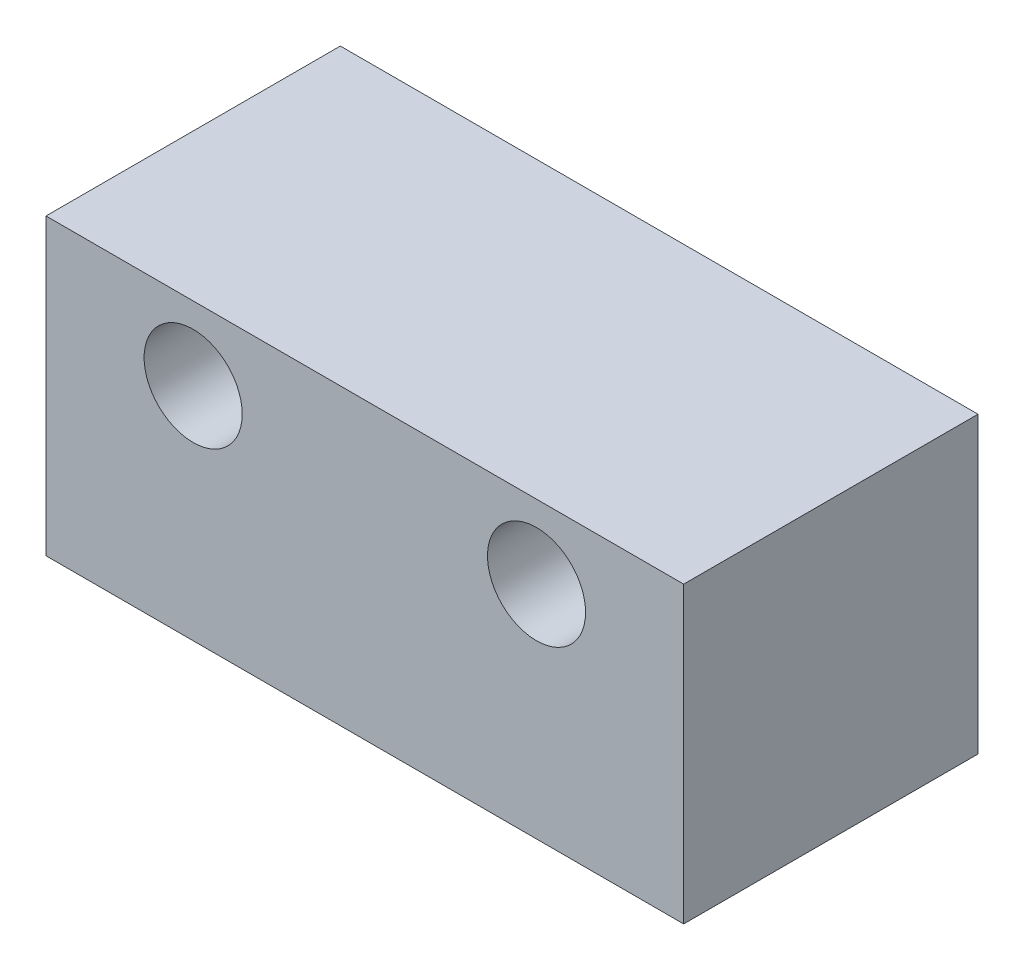
ISO-10303-21;
HEADER;
FILE_DESCRIPTION(('STEP AP214'),'2;1');
FILE_NAME('part.step','',(''),(''),'','','');
FILE_SCHEMA(('AUTOMOTIVE_DESIGN { 1 0 10303 214 1 1 1 1 }'));
ENDSEC;
DATA;
#1=APPLICATION_CONTEXT('core data for automotive mechanical design processes');
#2=APPLICATION_PROTOCOL_DEFINITION('international standard','automotive_design',2000,#1);
#3=PRODUCT_CONTEXT('',#1,'mechanical');
#4=PRODUCT('Part','Part','',(#3));
#5=PRODUCT_RELATED_PRODUCT_CATEGORY('part','',(#4));
#6=PRODUCT_DEFINITION_FORMATION('','',#4);
#7=PRODUCT_DEFINITION_CONTEXT('part definition',#1,'design');
#8=PRODUCT_DEFINITION('design','',#6,#7);
#9=PRODUCT_DEFINITION_SHAPE('','',#8);
#10=(LENGTH_UNIT() NAMED_UNIT(*) SI_UNIT(.MILLI.,.METRE.));
#11=(NAMED_UNIT(*) PLANE_ANGLE_UNIT() SI_UNIT($,.RADIAN.));
#12=(NAMED_UNIT(*) SI_UNIT($,.STERADIAN.) SOLID_ANGLE_UNIT());
#13=UNCERTAINTY_MEASURE_WITH_UNIT(LENGTH_MEASURE(1.E-05),#10,'distance_accuracy_value','');
#14=(GEOMETRIC_REPRESENTATION_CONTEXT(3) GLOBAL_UNCERTAINTY_ASSIGNED_CONTEXT((#13)) GLOBAL_UNIT_ASSIGNED_CONTEXT((#10,
#11,#12)) REPRESENTATION_CONTEXT('',''));
#15=CARTESIAN_POINT('',(0.,0.,0.));
#16=DIRECTION('',(0.,0.,1.));
#17=DIRECTION('',(1.,0.,0.));
#18=AXIS2_PLACEMENT_3D('',#15,#16,#17);
#19=CARTESIAN_POINT('',(0.,0.,6.));
#20=DIRECTION('',(-1.,0.,0.));
#21=DIRECTION('',(0.,0.,1.));
#22=AXIS2_PLACEMENT_3D('',#19,#20,#21);
#23=PLANE('',#22);
#24=DIRECTION('',(0.,1.,0.));
#25=VECTOR('',#24,1.);
#26=CARTESIAN_POINT('',(0.,0.,0.));
#27=LINE('',#26,#25);
#28=CARTESIAN_POINT('',(0.,0.,0.));
#29=VERTEX_POINT('',#28);
#30=CARTESIAN_POINT('',(0.,6.,0.));
#31=VERTEX_POINT('',#30);
#32=EDGE_CURVE('E111',#29,#31,#27,.T.);
#33=ORIENTED_EDGE('',*,*,#32,.F.);
#34=DIRECTION('',(0.,0.,-1.));
#35=VECTOR('',#34,1.);
#36=CARTESIAN_POINT('',(0.,0.,6.));
#37=LINE('',#36,#35);
#38=CARTESIAN_POINT('',(0.,0.,6.));
#39=VERTEX_POINT('',#38);
#40=EDGE_CURVE('E11',#39,#29,#37,.T.);
#41=ORIENTED_EDGE('',*,*,#40,.F.);
#42=DIRECTION('',(0.,1.,0.));
#43=VECTOR('',#42,1.);
#44=CARTESIAN_POINT('',(0.,0.,6.));
#45=LINE('',#44,#43);
#46=CARTESIAN_POINT('',(0.,6.,6.));
#47=VERTEX_POINT('',#46);
#48=EDGE_CURVE('E103',#39,#47,#45,.T.);
#49=ORIENTED_EDGE('',*,*,#48,.T.);
#50=DIRECTION('',(0.,0.,-1.));
#51=VECTOR('',#50,1.);
#52=CARTESIAN_POINT('',(0.,6.,6.));
#53=LINE('',#52,#51);
#54=EDGE_CURVE('E42',#47,#31,#53,.T.);
#55=ORIENTED_EDGE('',*,*,#54,.T.);
#56=EDGE_LOOP('',(#33,#41,#49,#55));
#57=FACE_BOUND('',#56,.T.);
#58=ADVANCED_FACE('F39',(#57),#23,.T.);
#59=CARTESIAN_POINT('',(0.,0.,6.));
#60=DIRECTION('',(0.,1.,0.));
#61=DIRECTION('',(0.,0.,1.));
#62=AXIS2_PLACEMENT_3D('',#59,#60,#61);
#63=PLANE('',#62);
#64=DIRECTION('',(1.,0.,0.));
#65=VECTOR('',#64,1.);
#66=CARTESIAN_POINT('',(0.,0.,0.));
#67=LINE('',#66,#65);
#68=CARTESIAN_POINT('',(13.,0.,0.));
#69=VERTEX_POINT('',#68);
#70=EDGE_CURVE('E73',#29,#69,#67,.T.);
#71=ORIENTED_EDGE('',*,*,#70,.T.);
#72=DIRECTION('',(0.,0.,-1.));
#73=VECTOR('',#72,1.);
#74=CARTESIAN_POINT('',(13.,0.,6.));
#75=LINE('',#74,#73);
#76=CARTESIAN_POINT('',(13.,0.,6.));
#77=VERTEX_POINT('',#76);
#78=EDGE_CURVE('E49',#77,#69,#75,.T.);
#79=ORIENTED_EDGE('',*,*,#78,.F.);
#80=DIRECTION('',(1.,0.,0.));
#81=VECTOR('',#80,1.);
#82=CARTESIAN_POINT('',(0.,0.,6.));
#83=LINE('',#82,#81);
#84=EDGE_CURVE('E90',#39,#77,#83,.T.);
#85=ORIENTED_EDGE('',*,*,#84,.F.);
#86=ORIENTED_EDGE('',*,*,#40,.T.);
#87=EDGE_LOOP('',(#71,#79,#85,#86));
#88=FACE_BOUND('',#87,.T.);
#89=ADVANCED_FACE('F128',(#88),#63,.F.);
#90=CARTESIAN_POINT('',(13.,0.,6.));
#91=DIRECTION('',(-1.,0.,0.));
#92=DIRECTION('',(0.,0.,1.));
#93=AXIS2_PLACEMENT_3D('',#90,#91,#92);
#94=PLANE('',#93);
#95=DIRECTION('',(0.,1.,0.));
#96=VECTOR('',#95,1.);
#97=CARTESIAN_POINT('',(13.,0.,0.));
#98=LINE('',#97,#96);
#99=CARTESIAN_POINT('',(13.,6.,0.));
#100=VERTEX_POINT('',#99);
#101=EDGE_CURVE('E98',#69,#100,#98,.T.);
#102=ORIENTED_EDGE('',*,*,#101,.T.);
#103=DIRECTION('',(0.,0.,-1.));
#104=VECTOR('',#103,1.);
#105=CARTESIAN_POINT('',(13.,6.,6.));
#106=LINE('',#105,#104);
#107=CARTESIAN_POINT('',(13.,6.,6.));
#108=VERTEX_POINT('',#107);
#109=EDGE_CURVE('E95',#108,#100,#106,.T.);
#110=ORIENTED_EDGE('',*,*,#109,.F.);
#111=DIRECTION('',(0.,1.,0.));
#112=VECTOR('',#111,1.);
#113=CARTESIAN_POINT('',(13.,0.,6.));
#114=LINE('',#113,#112);
#115=EDGE_CURVE('E85',#77,#108,#114,.T.);
#116=ORIENTED_EDGE('',*,*,#115,.F.);
#117=ORIENTED_EDGE('',*,*,#78,.T.);
#118=EDGE_LOOP('',(#102,#110,#116,#117));
#119=FACE_BOUND('',#118,.T.);
#120=ADVANCED_FACE('F96',(#119),#94,.F.);
#121=CARTESIAN_POINT('',(0.,6.,6.));
#122=DIRECTION('',(0.,1.,0.));
#123=DIRECTION('',(0.,0.,1.));
#124=AXIS2_PLACEMENT_3D('',#121,#122,#123);
#125=PLANE('',#124);
#126=DIRECTION('',(1.,0.,0.));
#127=VECTOR('',#126,1.);
#128=CARTESIAN_POINT('',(0.,6.,0.));
#129=LINE('',#128,#127);
#130=EDGE_CURVE('E115',#31,#100,#129,.T.);
#131=ORIENTED_EDGE('',*,*,#130,.F.);
#132=ORIENTED_EDGE('',*,*,#54,.F.);
#133=DIRECTION('',(1.,0.,0.));
#134=VECTOR('',#133,1.);
#135=CARTESIAN_POINT('',(0.,6.,6.));
#136=LINE('',#135,#134);
#137=EDGE_CURVE('E89',#47,#108,#136,.T.);
#138=ORIENTED_EDGE('',*,*,#137,.T.);
#139=ORIENTED_EDGE('',*,*,#109,.T.);
#140=EDGE_LOOP('',(#131,#132,#138,#139));
#141=FACE_BOUND('',#140,.T.);
#142=ADVANCED_FACE('F101',(#141),#125,.T.);
#143=CARTESIAN_POINT('',(0.,0.,6.));
#144=DIRECTION('',(0.,0.,-1.));
#145=DIRECTION('',(-1.,0.,0.));
#146=AXIS2_PLACEMENT_3D('',#143,#144,#145);
#147=PLANE('',#146);
#148=CARTESIAN_POINT('',(3.,4.5,6.));
#149=DIRECTION('',(0.,0.,1.));
#150=DIRECTION('',(1.,0.,0.));
#151=AXIS2_PLACEMENT_3D('',#148,#149,#150);
#152=CIRCLE('',#151,1.);
#153=CARTESIAN_POINT('',(4.,4.5,6.));
#154=VERTEX_POINT('',#153);
#155=EDGE_CURVE('E164',#154,#154,#152,.T.);
#156=ORIENTED_EDGE('',*,*,#155,.F.);
#157=EDGE_LOOP('',(#156));
#158=FACE_BOUND('',#157,.T.);
#159=CARTESIAN_POINT('',(10.,4.5,6.));
#160=DIRECTION('',(0.,0.,1.));
#161=DIRECTION('',(1.,0.,0.));
#162=AXIS2_PLACEMENT_3D('',#159,#160,#161);
#163=CIRCLE('',#162,1.);
#164=CARTESIAN_POINT('',(11.,4.5,6.));
#165=VERTEX_POINT('',#164);
#166=EDGE_CURVE('E172',#165,#165,#163,.T.);
#167=ORIENTED_EDGE('',*,*,#166,.F.);
#168=EDGE_LOOP('',(#167));
#169=FACE_BOUND('',#168,.T.);
#170=ORIENTED_EDGE('',*,*,#48,.F.);
#171=ORIENTED_EDGE('',*,*,#84,.T.);
#172=ORIENTED_EDGE('',*,*,#115,.T.);
#173=ORIENTED_EDGE('',*,*,#137,.F.);
#174=EDGE_LOOP('',(#170,#171,#172,#173));
#175=FACE_BOUND('',#174,.T.);
#176=ADVANCED_FACE('F88',(#158,#169,#175),#147,.F.);
#177=CARTESIAN_POINT('',(0.,0.,0.));
#178=DIRECTION('',(0.,0.,-1.));
#179=DIRECTION('',(-1.,0.,0.));
#180=AXIS2_PLACEMENT_3D('',#177,#178,#179);
#181=PLANE('',#180);
#182=CARTESIAN_POINT('',(3.,4.5,0.));
#183=DIRECTION('',(0.,0.,1.));
#184=DIRECTION('',(1.,0.,0.));
#185=AXIS2_PLACEMENT_3D('',#182,#183,#184);
#186=CIRCLE('',#185,1.);
#187=CARTESIAN_POINT('',(4.,4.5,0.));
#188=VERTEX_POINT('',#187);
#189=EDGE_CURVE('E116',#188,#188,#186,.T.);
#190=ORIENTED_EDGE('',*,*,#189,.T.);
#191=EDGE_LOOP('',(#190));
#192=FACE_BOUND('',#191,.T.);
#193=CARTESIAN_POINT('',(10.,4.5,0.));
#194=DIRECTION('',(0.,0.,1.));
#195=DIRECTION('',(1.,0.,0.));
#196=AXIS2_PLACEMENT_3D('',#193,#194,#195);
#197=CIRCLE('',#196,1.);
#198=CARTESIAN_POINT('',(11.,4.5,0.));
#199=VERTEX_POINT('',#198);
#200=EDGE_CURVE('E166',#199,#199,#197,.T.);
#201=ORIENTED_EDGE('',*,*,#200,.T.);
#202=EDGE_LOOP('',(#201));
#203=FACE_BOUND('',#202,.T.);
#204=ORIENTED_EDGE('',*,*,#32,.T.);
#205=ORIENTED_EDGE('',*,*,#130,.T.);
#206=ORIENTED_EDGE('',*,*,#101,.F.);
#207=ORIENTED_EDGE('',*,*,#70,.F.);
#208=EDGE_LOOP('',(#204,#205,#206,#207));
#209=FACE_BOUND('',#208,.T.);
#210=ADVANCED_FACE('F125',(#192,#203,#209),#181,.T.);
#211=CARTESIAN_POINT('',(10.,4.5,0.));
#212=DIRECTION('',(0.,0.,1.));
#213=DIRECTION('',(1.,0.,0.));
#214=AXIS2_PLACEMENT_3D('',#211,#212,#213);
#215=CYLINDRICAL_SURFACE('',#214,1.);
#216=ORIENTED_EDGE('',*,*,#200,.F.);
#217=EDGE_LOOP('',(#216));
#218=FACE_BOUND('',#217,.T.);
#219=ORIENTED_EDGE('',*,*,#166,.T.);
#220=EDGE_LOOP('',(#219));
#221=FACE_BOUND('',#220,.T.);
#222=ADVANCED_FACE('F147',(#218,#221),#215,.F.);
#223=CARTESIAN_POINT('',(3.,4.5,0.));
#224=DIRECTION('',(0.,0.,1.));
#225=DIRECTION('',(1.,0.,0.));
#226=AXIS2_PLACEMENT_3D('',#223,#224,#225);
#227=CYLINDRICAL_SURFACE('',#226,1.);
#228=ORIENTED_EDGE('',*,*,#189,.F.);
#229=EDGE_LOOP('',(#228));
#230=FACE_BOUND('',#229,.T.);
#231=ORIENTED_EDGE('',*,*,#155,.T.);
#232=EDGE_LOOP('',(#231));
#233=FACE_BOUND('',#232,.T.);
#234=ADVANCED_FACE('F154',(#230,#233),#227,.F.);
#235=CLOSED_SHELL('',(#58,#89,#120,#142,#176,#210,#222,#234));
#236=MANIFOLD_SOLID_BREP('B2',#235);
#237=ADVANCED_BREP_SHAPE_REPRESENTATION('',(#18,#236),#14);
#238=SHAPE_DEFINITION_REPRESENTATION(#9,#237);
ENDSEC;
END-ISO-10303-21;
